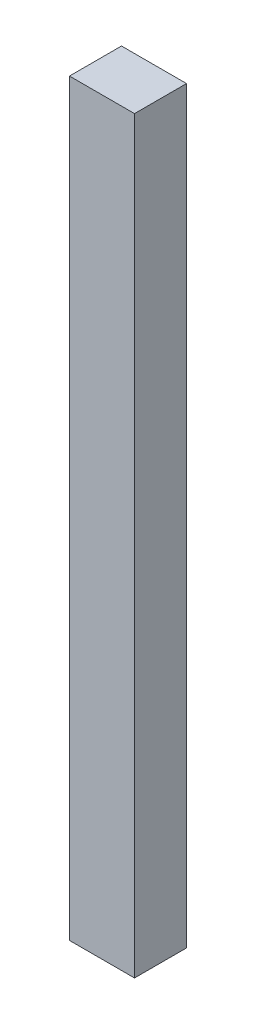
ISO-10303-21;
HEADER;
FILE_DESCRIPTION(('STEP AP214'),'2;1');
FILE_NAME('part.step','',(''),(''),'','','');
FILE_SCHEMA(('AUTOMOTIVE_DESIGN { 1 0 10303 214 1 1 1 1 }'));
ENDSEC;
DATA;
#1=APPLICATION_CONTEXT('core data for automotive mechanical design processes');
#2=APPLICATION_PROTOCOL_DEFINITION('international standard','automotive_design',2000,#1);
#3=PRODUCT_CONTEXT('',#1,'mechanical');
#4=PRODUCT('Part','Part','',(#3));
#5=PRODUCT_RELATED_PRODUCT_CATEGORY('part','',(#4));
#6=PRODUCT_DEFINITION_FORMATION('','',#4);
#7=PRODUCT_DEFINITION_CONTEXT('part definition',#1,'design');
#8=PRODUCT_DEFINITION('design','',#6,#7);
#9=PRODUCT_DEFINITION_SHAPE('','',#8);
#10=(LENGTH_UNIT() NAMED_UNIT(*) SI_UNIT(.MILLI.,.METRE.));
#11=(NAMED_UNIT(*) PLANE_ANGLE_UNIT() SI_UNIT($,.RADIAN.));
#12=(NAMED_UNIT(*) SI_UNIT($,.STERADIAN.) SOLID_ANGLE_UNIT());
#13=UNCERTAINTY_MEASURE_WITH_UNIT(LENGTH_MEASURE(1.E-05),#10,'distance_accuracy_value','');
#14=(GEOMETRIC_REPRESENTATION_CONTEXT(3) GLOBAL_UNCERTAINTY_ASSIGNED_CONTEXT((#13)) GLOBAL_UNIT_ASSIGNED_CONTEXT((#10,
#11,#12)) REPRESENTATION_CONTEXT('',''));
#15=CARTESIAN_POINT('',(0.,0.,0.));
#16=DIRECTION('',(0.,0.,1.));
#17=DIRECTION('',(1.,0.,0.));
#18=AXIS2_PLACEMENT_3D('',#15,#16,#17);
#19=CARTESIAN_POINT('',(-23.5,186.453124237433,0.));
#20=DIRECTION('',(-1.,0.,0.));
#21=DIRECTION('',(0.,0.,1.));
#22=AXIS2_PLACEMENT_3D('',#19,#20,#21);
#23=PLANE('',#22);
#24=DIRECTION('',(0.,0.,1.));
#25=VECTOR('',#24,1.);
#26=CARTESIAN_POINT('',(-23.5,122.5,10.));
#27=LINE('',#26,#25);
#28=CARTESIAN_POINT('',(-23.5,122.5,10.));
#29=VERTEX_POINT('',#28);
#30=CARTESIAN_POINT('',(-23.5,122.5,14.));
#31=VERTEX_POINT('',#30);
#32=EDGE_CURVE('E62',#29,#31,#27,.T.);
#33=ORIENTED_EDGE('',*,*,#32,.F.);
#34=DIRECTION('',(0.,-1.,0.));
#35=VECTOR('',#34,1.);
#36=CARTESIAN_POINT('',(-23.5,186.453124237433,10.));
#37=LINE('',#36,#35);
#38=CARTESIAN_POINT('',(-23.5,180.05,10.));
#39=VERTEX_POINT('',#38);
#40=EDGE_CURVE('E103',#39,#29,#37,.T.);
#41=ORIENTED_EDGE('',*,*,#40,.F.);
#42=DIRECTION('',(0.,0.,-1.));
#43=VECTOR('',#42,1.);
#44=CARTESIAN_POINT('',(-23.5,180.05,0.));
#45=LINE('',#44,#43);
#46=CARTESIAN_POINT('',(-23.5,180.05,14.));
#47=VERTEX_POINT('',#46);
#48=EDGE_CURVE('E54',#47,#39,#45,.T.);
#49=ORIENTED_EDGE('',*,*,#48,.F.);
#50=DIRECTION('',(0.,-1.,0.));
#51=VECTOR('',#50,1.);
#52=CARTESIAN_POINT('',(-23.5,186.453124237433,14.));
#53=LINE('',#52,#51);
#54=EDGE_CURVE('E48',#47,#31,#53,.T.);
#55=ORIENTED_EDGE('',*,*,#54,.T.);
#56=EDGE_LOOP('',(#33,#41,#49,#55));
#57=FACE_BOUND('',#56,.T.);
#58=ADVANCED_FACE('F44',(#57),#23,.F.);
#59=CARTESIAN_POINT('',(0.,186.453124237433,10.));
#60=DIRECTION('',(0.,0.,-1.));
#61=DIRECTION('',(-1.,0.,0.));
#62=AXIS2_PLACEMENT_3D('',#59,#60,#61);
#63=PLANE('',#62);
#64=ORIENTED_EDGE('',*,*,#40,.T.);
#65=DIRECTION('',(1.,0.,0.));
#66=VECTOR('',#65,1.);
#67=CARTESIAN_POINT('',(-28.5,122.5,10.));
#68=LINE('',#67,#66);
#69=CARTESIAN_POINT('',(-28.5,122.5,10.));
#70=VERTEX_POINT('',#69);
#71=EDGE_CURVE('E89',#70,#29,#68,.T.);
#72=ORIENTED_EDGE('',*,*,#71,.F.);
#73=DIRECTION('',(0.,-1.,0.));
#74=VECTOR('',#73,1.);
#75=CARTESIAN_POINT('',(-28.5,186.453124237433,10.));
#76=LINE('',#75,#74);
#77=CARTESIAN_POINT('',(-28.5,180.05,10.));
#78=VERTEX_POINT('',#77);
#79=EDGE_CURVE('E100',#78,#70,#76,.T.);
#80=ORIENTED_EDGE('',*,*,#79,.F.);
#81=DIRECTION('',(1.,0.,0.));
#82=VECTOR('',#81,1.);
#83=CARTESIAN_POINT('',(0.,180.05,10.));
#84=LINE('',#83,#82);
#85=EDGE_CURVE('E114',#78,#39,#84,.T.);
#86=ORIENTED_EDGE('',*,*,#85,.T.);
#87=EDGE_LOOP('',(#64,#72,#80,#86));
#88=FACE_BOUND('',#87,.T.);
#89=ADVANCED_FACE('F99',(#88),#63,.T.);
#90=CARTESIAN_POINT('',(-28.5,186.453124237433,0.));
#91=DIRECTION('',(1.,0.,0.));
#92=DIRECTION('',(0.,0.,-1.));
#93=AXIS2_PLACEMENT_3D('',#90,#91,#92);
#94=PLANE('',#93);
#95=DIRECTION('',(0.,0.,-1.));
#96=VECTOR('',#95,1.);
#97=CARTESIAN_POINT('',(-28.5,122.5,14.));
#98=LINE('',#97,#96);
#99=CARTESIAN_POINT('',(-28.5,122.5,14.));
#100=VERTEX_POINT('',#99);
#101=EDGE_CURVE('E86',#100,#70,#98,.T.);
#102=ORIENTED_EDGE('',*,*,#101,.F.);
#103=DIRECTION('',(0.,-1.,0.));
#104=VECTOR('',#103,1.);
#105=CARTESIAN_POINT('',(-28.5,186.453124237433,14.));
#106=LINE('',#105,#104);
#107=CARTESIAN_POINT('',(-28.5,180.05,14.));
#108=VERTEX_POINT('',#107);
#109=EDGE_CURVE('E108',#108,#100,#106,.T.);
#110=ORIENTED_EDGE('',*,*,#109,.F.);
#111=DIRECTION('',(0.,0.,1.));
#112=VECTOR('',#111,1.);
#113=CARTESIAN_POINT('',(-28.5,180.05,0.));
#114=LINE('',#113,#112);
#115=EDGE_CURVE('E11',#78,#108,#114,.T.);
#116=ORIENTED_EDGE('',*,*,#115,.F.);
#117=ORIENTED_EDGE('',*,*,#79,.T.);
#118=EDGE_LOOP('',(#102,#110,#116,#117));
#119=FACE_BOUND('',#118,.T.);
#120=ADVANCED_FACE('F106',(#119),#94,.F.);
#121=CARTESIAN_POINT('',(0.,186.453124237433,14.));
#122=DIRECTION('',(0.,0.,-1.));
#123=DIRECTION('',(-1.,0.,0.));
#124=AXIS2_PLACEMENT_3D('',#121,#122,#123);
#125=PLANE('',#124);
#126=DIRECTION('',(-1.,0.,0.));
#127=VECTOR('',#126,1.);
#128=CARTESIAN_POINT('',(-23.5,122.5,14.));
#129=LINE('',#128,#127);
#130=EDGE_CURVE('E90',#31,#100,#129,.T.);
#131=ORIENTED_EDGE('',*,*,#130,.F.);
#132=ORIENTED_EDGE('',*,*,#54,.F.);
#133=DIRECTION('',(1.,0.,0.));
#134=VECTOR('',#133,1.);
#135=CARTESIAN_POINT('',(0.,180.05,14.));
#136=LINE('',#135,#134);
#137=EDGE_CURVE('E112',#108,#47,#136,.T.);
#138=ORIENTED_EDGE('',*,*,#137,.F.);
#139=ORIENTED_EDGE('',*,*,#109,.T.);
#140=EDGE_LOOP('',(#131,#132,#138,#139));
#141=FACE_BOUND('',#140,.T.);
#142=ADVANCED_FACE('F134',(#141),#125,.F.);
#143=CARTESIAN_POINT('',(0.,180.05,0.));
#144=DIRECTION('',(0.,1.,0.));
#145=DIRECTION('',(0.,0.,1.));
#146=AXIS2_PLACEMENT_3D('',#143,#144,#145);
#147=PLANE('',#146);
#148=ORIENTED_EDGE('',*,*,#137,.T.);
#149=ORIENTED_EDGE('',*,*,#48,.T.);
#150=ORIENTED_EDGE('',*,*,#85,.F.);
#151=ORIENTED_EDGE('',*,*,#115,.T.);
#152=EDGE_LOOP('',(#148,#149,#150,#151));
#153=FACE_BOUND('',#152,.T.);
#154=ADVANCED_FACE('F46',(#153),#147,.T.);
#155=CARTESIAN_POINT('',(0.,122.5,0.));
#156=DIRECTION('',(0.,-1.,0.));
#157=DIRECTION('',(0.,0.,-1.));
#158=AXIS2_PLACEMENT_3D('',#155,#156,#157);
#159=PLANE('',#158);
#160=ORIENTED_EDGE('',*,*,#71,.T.);
#161=ORIENTED_EDGE('',*,*,#32,.T.);
#162=ORIENTED_EDGE('',*,*,#130,.T.);
#163=ORIENTED_EDGE('',*,*,#101,.T.);
#164=EDGE_LOOP('',(#160,#161,#162,#163));
#165=FACE_BOUND('',#164,.T.);
#166=ADVANCED_FACE('F88',(#165),#159,.T.);
#167=CLOSED_SHELL('',(#58,#89,#120,#142,#154,#166));
#168=MANIFOLD_SOLID_BREP('B2',#167);
#169=ADVANCED_BREP_SHAPE_REPRESENTATION('',(#18,#168),#14);
#170=SHAPE_DEFINITION_REPRESENTATION(#9,#169);
ENDSEC;
END-ISO-10303-21;
